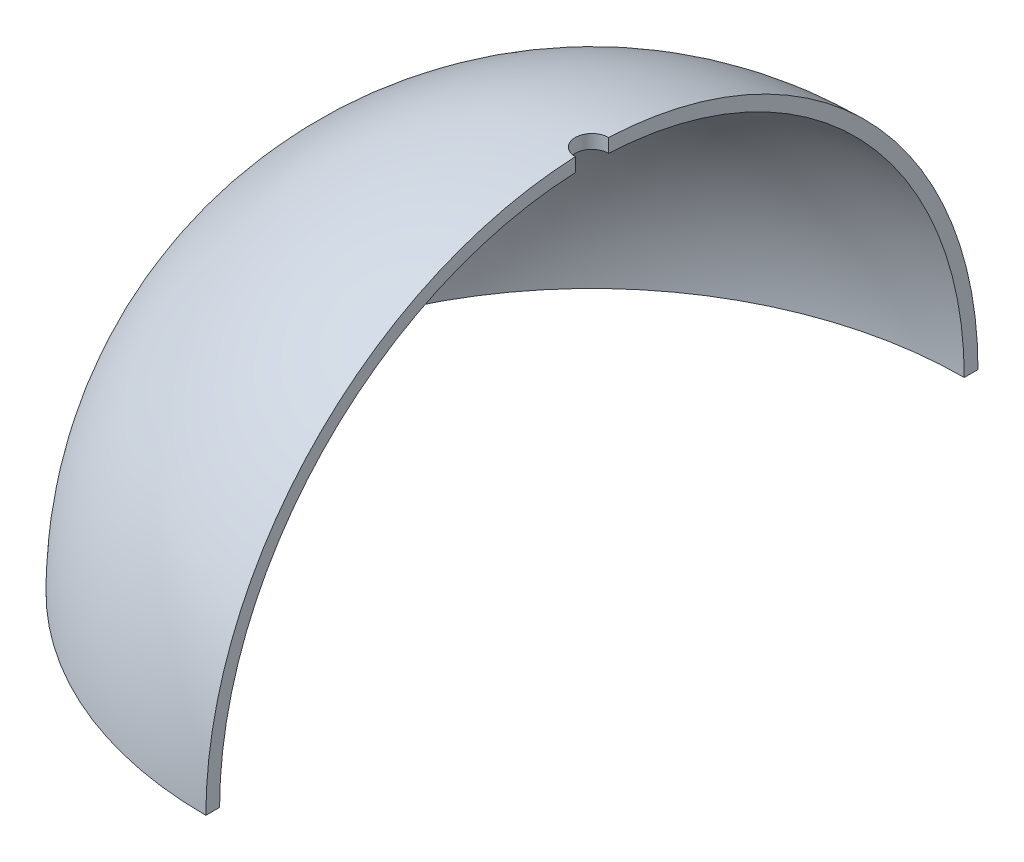
ISO-10303-21;
HEADER;
FILE_DESCRIPTION(('STEP AP214'),'2;1');
FILE_NAME('part.step','',(''),(''),'','','');
FILE_SCHEMA(('AUTOMOTIVE_DESIGN { 1 0 10303 214 1 1 1 1 }'));
ENDSEC;
DATA;
#1=APPLICATION_CONTEXT('core data for automotive mechanical design processes');
#2=APPLICATION_PROTOCOL_DEFINITION('international standard','automotive_design',2000,#1);
#3=PRODUCT_CONTEXT('',#1,'mechanical');
#4=PRODUCT('Part','Part','',(#3));
#5=PRODUCT_RELATED_PRODUCT_CATEGORY('part','',(#4));
#6=PRODUCT_DEFINITION_FORMATION('','',#4);
#7=PRODUCT_DEFINITION_CONTEXT('part definition',#1,'design');
#8=PRODUCT_DEFINITION('design','',#6,#7);
#9=PRODUCT_DEFINITION_SHAPE('','',#8);
#10=(LENGTH_UNIT() NAMED_UNIT(*) SI_UNIT(.MILLI.,.METRE.));
#11=(NAMED_UNIT(*) PLANE_ANGLE_UNIT() SI_UNIT($,.RADIAN.));
#12=(NAMED_UNIT(*) SI_UNIT($,.STERADIAN.) SOLID_ANGLE_UNIT());
#13=UNCERTAINTY_MEASURE_WITH_UNIT(LENGTH_MEASURE(1.E-05),#10,'distance_accuracy_value','');
#14=(GEOMETRIC_REPRESENTATION_CONTEXT(3) GLOBAL_UNCERTAINTY_ASSIGNED_CONTEXT((#13)) GLOBAL_UNIT_ASSIGNED_CONTEXT((#10,
#11,#12)) REPRESENTATION_CONTEXT('',''));
#15=CARTESIAN_POINT('',(0.,0.,0.));
#16=DIRECTION('',(0.,0.,1.));
#17=DIRECTION('',(1.,0.,0.));
#18=AXIS2_PLACEMENT_3D('',#15,#16,#17);
#19=CARTESIAN_POINT('',(0.,0.,0.));
#20=DIRECTION('',(0.,0.,1.));
#21=DIRECTION('',(0.,-1.,0.));
#22=AXIS2_PLACEMENT_3D('',#19,#20,#21);
#23=SPHERICAL_SURFACE('',#22,9275.);
#24=CARTESIAN_POINT('',(0.,9266.37064874917,0.));
#25=DIRECTION('',(0.,-1.,0.));
#26=DIRECTION('',(0.,0.,-1.));
#27=AXIS2_PLACEMENT_3D('',#24,#25,#26);
#28=CIRCLE('',#27,400.);
#29=CARTESIAN_POINT('',(3.23533601989114E-11,9266.37064874917,399.999999999989));
#30=VERTEX_POINT('',#29);
#31=CARTESIAN_POINT('',(3.23533601989114E-11,9266.37064874917,-399.999999999989));
#32=VERTEX_POINT('',#31);
#33=EDGE_CURVE('E88',#30,#32,#28,.T.);
#34=ORIENTED_EDGE('',*,*,#33,.T.);
#35=CARTESIAN_POINT('',(0.,0.,0.));
#36=DIRECTION('',(1.,0.,0.));
#37=DIRECTION('',(0.,0.,1.));
#38=AXIS2_PLACEMENT_3D('',#35,#36,#37);
#39=CIRCLE('',#38,9275.);
#40=CARTESIAN_POINT('',(0.,-2.25052482878047E-12,-9275.));
#41=VERTEX_POINT('',#40);
#42=EDGE_CURVE('E96',#41,#32,#39,.T.);
#43=ORIENTED_EDGE('',*,*,#42,.F.);
#44=CARTESIAN_POINT('',(0.,0.,0.));
#45=DIRECTION('',(0.,1.,0.));
#46=DIRECTION('',(0.,0.,1.));
#47=AXIS2_PLACEMENT_3D('',#44,#45,#46);
#48=CIRCLE('',#47,9275.);
#49=CARTESIAN_POINT('',(0.,-2.25052482878047E-12,9275.));
#50=VERTEX_POINT('',#49);
#51=EDGE_CURVE('E69',#41,#50,#48,.T.);
#52=ORIENTED_EDGE('',*,*,#51,.T.);
#53=EDGE_CURVE('E98',#30,#50,#39,.T.);
#54=ORIENTED_EDGE('',*,*,#53,.F.);
#55=EDGE_LOOP('',(#34,#43,#52,#54));
#56=FACE_BOUND('',#55,.T.);
#57=ADVANCED_FACE('F45',(#56),#23,.T.);
#58=CARTESIAN_POINT('',(0.,0.,0.));
#59=DIRECTION('',(0.,0.,1.));
#60=DIRECTION('',(0.,-1.,0.));
#61=AXIS2_PLACEMENT_3D('',#58,#59,#60);
#62=SPHERICAL_SURFACE('',#61,8945.);
#63=CARTESIAN_POINT('',(0.,8936.05198060083,0.));
#64=DIRECTION('',(0.,-1.,0.));
#65=DIRECTION('',(0.,0.,-1.));
#66=AXIS2_PLACEMENT_3D('',#63,#64,#65);
#67=CIRCLE('',#66,400.);
#68=CARTESIAN_POINT('',(3.12000587332E-11,8936.05198060083,399.999999999989));
#69=VERTEX_POINT('',#68);
#70=CARTESIAN_POINT('',(0.,8936.05198060083,-400.));
#71=VERTEX_POINT('',#70);
#72=EDGE_CURVE('E61',#69,#71,#67,.T.);
#73=ORIENTED_EDGE('',*,*,#72,.F.);
#74=CARTESIAN_POINT('',(0.,0.,0.));
#75=DIRECTION('',(-1.,0.,0.));
#76=DIRECTION('',(0.,0.,1.));
#77=AXIS2_PLACEMENT_3D('',#74,#75,#76);
#78=CIRCLE('',#77,8945.);
#79=CARTESIAN_POINT('',(0.,0.,8945.));
#80=VERTEX_POINT('',#79);
#81=EDGE_CURVE('E114',#80,#69,#78,.T.);
#82=ORIENTED_EDGE('',*,*,#81,.F.);
#83=CARTESIAN_POINT('',(0.,0.,0.));
#84=DIRECTION('',(0.,-1.,0.));
#85=DIRECTION('',(0.,0.,1.));
#86=AXIS2_PLACEMENT_3D('',#83,#84,#85);
#87=CIRCLE('',#86,8945.);
#88=CARTESIAN_POINT('',(0.,0.,-8945.));
#89=VERTEX_POINT('',#88);
#90=EDGE_CURVE('E110',#80,#89,#87,.T.);
#91=ORIENTED_EDGE('',*,*,#90,.T.);
#92=EDGE_CURVE('E108',#71,#89,#78,.T.);
#93=ORIENTED_EDGE('',*,*,#92,.F.);
#94=EDGE_LOOP('',(#73,#82,#91,#93));
#95=FACE_BOUND('',#94,.T.);
#96=ADVANCED_FACE('F47',(#95),#62,.F.);
#97=CARTESIAN_POINT('',(0.,0.,0.));
#98=DIRECTION('',(1.,0.,0.));
#99=DIRECTION('',(0.,0.,1.));
#100=AXIS2_PLACEMENT_3D('',#97,#98,#99);
#101=PLANE('',#100);
#102=ORIENTED_EDGE('',*,*,#81,.T.);
#103=DIRECTION('',(0.,-1.,0.));
#104=VECTOR('',#103,1.);
#105=CARTESIAN_POINT('',(3.23834929092514E-11,9275.001,400.));
#106=LINE('',#105,#104);
#107=EDGE_CURVE('E11',#69,#30,#106,.F.);
#108=ORIENTED_EDGE('',*,*,#107,.T.);
#109=ORIENTED_EDGE('',*,*,#53,.T.);
#110=DIRECTION('',(0.,0.,-1.));
#111=VECTOR('',#110,1.);
#112=CARTESIAN_POINT('',(0.,0.,8945.));
#113=LINE('',#112,#111);
#114=EDGE_CURVE('E103',#50,#80,#113,.T.);
#115=ORIENTED_EDGE('',*,*,#114,.T.);
#116=EDGE_LOOP('',(#102,#108,#109,#115));
#117=FACE_BOUND('',#116,.T.);
#118=ADVANCED_FACE('F129',(#117),#101,.T.);
#119=ORIENTED_EDGE('',*,*,#42,.T.);
#120=DIRECTION('',(0.,-1.,0.));
#121=VECTOR('',#120,1.);
#122=CARTESIAN_POINT('',(3.23834929092514E-11,9275.001,-400.));
#123=LINE('',#122,#121);
#124=EDGE_CURVE('E54',#32,#71,#123,.T.);
#125=ORIENTED_EDGE('',*,*,#124,.T.);
#126=ORIENTED_EDGE('',*,*,#92,.T.);
#127=DIRECTION('',(0.,0.,-1.));
#128=VECTOR('',#127,1.);
#129=CARTESIAN_POINT('',(0.,-2.25052482878047E-12,-9275.));
#130=LINE('',#129,#128);
#131=EDGE_CURVE('E93',#89,#41,#130,.T.);
#132=ORIENTED_EDGE('',*,*,#131,.T.);
#133=EDGE_LOOP('',(#119,#125,#126,#132));
#134=FACE_BOUND('',#133,.T.);
#135=ADVANCED_FACE('F101',(#134),#101,.T.);
#136=CARTESIAN_POINT('',(0.,0.,0.));
#137=DIRECTION('',(0.,1.,0.));
#138=DIRECTION('',(0.,0.,1.));
#139=AXIS2_PLACEMENT_3D('',#136,#137,#138);
#140=PLANE('',#139);
#141=ORIENTED_EDGE('',*,*,#51,.F.);
#142=ORIENTED_EDGE('',*,*,#131,.F.);
#143=ORIENTED_EDGE('',*,*,#90,.F.);
#144=ORIENTED_EDGE('',*,*,#114,.F.);
#145=EDGE_LOOP('',(#141,#142,#143,#144));
#146=FACE_BOUND('',#145,.T.);
#147=ADVANCED_FACE('F122',(#146),#140,.F.);
#148=CARTESIAN_POINT('',(0.,9275.001,0.));
#149=DIRECTION('',(0.,-1.,0.));
#150=DIRECTION('',(0.,0.,-1.));
#151=AXIS2_PLACEMENT_3D('',#148,#149,#150);
#152=CYLINDRICAL_SURFACE('',#151,400.);
#153=ORIENTED_EDGE('',*,*,#72,.T.);
#154=ORIENTED_EDGE('',*,*,#124,.F.);
#155=ORIENTED_EDGE('',*,*,#33,.F.);
#156=ORIENTED_EDGE('',*,*,#107,.F.);
#157=EDGE_LOOP('',(#153,#154,#155,#156));
#158=FACE_BOUND('',#157,.T.);
#159=ADVANCED_FACE('F87',(#158),#152,.F.);
#160=CLOSED_SHELL('',(#57,#96,#118,#135,#147,#159));
#161=MANIFOLD_SOLID_BREP('B2',#160);
#162=ADVANCED_BREP_SHAPE_REPRESENTATION('',(#18,#161),#14);
#163=SHAPE_DEFINITION_REPRESENTATION(#9,#162);
ENDSEC;
END-ISO-10303-21;
